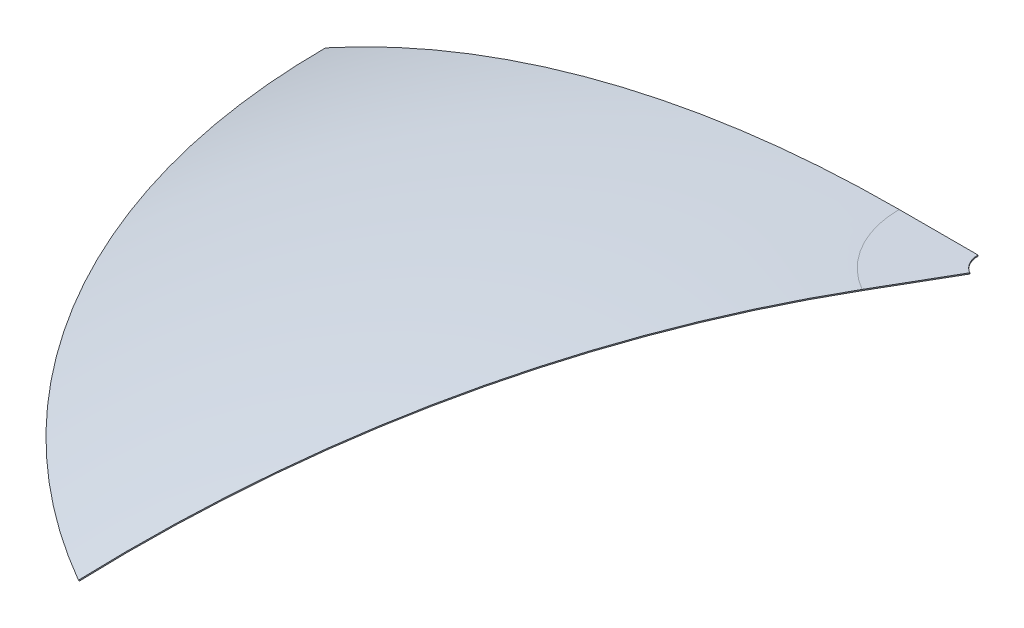
ISO-10303-21;
HEADER;
FILE_DESCRIPTION(('STEP AP214'),'2;1');
FILE_NAME('part.step','',(''),(''),'','','');
FILE_SCHEMA(('AUTOMOTIVE_DESIGN { 1 0 10303 214 1 1 1 1 }'));
ENDSEC;
DATA;
#1=APPLICATION_CONTEXT('core data for automotive mechanical design processes');
#2=APPLICATION_PROTOCOL_DEFINITION('international standard','automotive_design',2000,#1);
#3=PRODUCT_CONTEXT('',#1,'mechanical');
#4=PRODUCT('Part','Part','',(#3));
#5=PRODUCT_RELATED_PRODUCT_CATEGORY('part','',(#4));
#6=PRODUCT_DEFINITION_FORMATION('','',#4);
#7=PRODUCT_DEFINITION_CONTEXT('part definition',#1,'design');
#8=PRODUCT_DEFINITION('design','',#6,#7);
#9=PRODUCT_DEFINITION_SHAPE('','',#8);
#10=(LENGTH_UNIT() NAMED_UNIT(*) SI_UNIT(.MILLI.,.METRE.));
#11=(NAMED_UNIT(*) PLANE_ANGLE_UNIT() SI_UNIT($,.RADIAN.));
#12=(NAMED_UNIT(*) SI_UNIT($,.STERADIAN.) SOLID_ANGLE_UNIT());
#13=UNCERTAINTY_MEASURE_WITH_UNIT(LENGTH_MEASURE(1.E-05),#10,'distance_accuracy_value','');
#14=(GEOMETRIC_REPRESENTATION_CONTEXT(3) GLOBAL_UNCERTAINTY_ASSIGNED_CONTEXT((#13)) GLOBAL_UNIT_ASSIGNED_CONTEXT((#10,
#11,#12)) REPRESENTATION_CONTEXT('',''));
#15=CARTESIAN_POINT('',(0.,0.,0.));
#16=DIRECTION('',(0.,0.,1.));
#17=DIRECTION('',(1.,0.,0.));
#18=AXIS2_PLACEMENT_3D('',#15,#16,#17);
#19=CARTESIAN_POINT('',(-22.4999999999999,1.50000000000002,38.9711431702998));
#20=DIRECTION('',(0.,1.,0.));
#21=DIRECTION('',(-1.,0.,0.));
#22=AXIS2_PLACEMENT_3D('',#19,#20,#21);
#23=PLANE('',#22);
#24=CARTESIAN_POINT('',(0.,1.49999999999995,0.));
#25=DIRECTION('',(0.,-1.,0.));
#26=DIRECTION('',(1.,0.,0.));
#27=AXIS2_PLACEMENT_3D('',#24,#25,#26);
#28=CIRCLE('',#27,10.);
#29=CARTESIAN_POINT('',(-4.99999999999998,1.50000000000002,8.6602540378444));
#30=VERTEX_POINT('',#29);
#31=CARTESIAN_POINT('',(-10.,1.5,0.));
#32=VERTEX_POINT('',#31);
#33=EDGE_CURVE('E55',#30,#32,#28,.T.);
#34=ORIENTED_EDGE('',*,*,#33,.F.);
#35=DIRECTION('',(0.499999999999998,0.,-0.86602540378444));
#36=VECTOR('',#35,1.);
#37=CARTESIAN_POINT('',(-22.4999999999999,1.50000000000008,38.9711431702998));
#38=LINE('',#37,#36);
#39=CARTESIAN_POINT('',(-22.4999999999999,1.50000000000008,38.9711431702998));
#40=VERTEX_POINT('',#39);
#41=EDGE_CURVE('E128',#40,#30,#38,.T.);
#42=ORIENTED_EDGE('',*,*,#41,.F.);
#43=CARTESIAN_POINT('',(0.,1.50000000000017,0.));
#44=DIRECTION('',(0.,-1.,0.));
#45=DIRECTION('',(1.,0.,0.));
#46=AXIS2_PLACEMENT_3D('',#43,#44,#45);
#47=CIRCLE('',#46,45.);
#48=CARTESIAN_POINT('',(-45.,1.5,0.));
#49=VERTEX_POINT('',#48);
#50=EDGE_CURVE('E11',#40,#49,#47,.T.);
#51=ORIENTED_EDGE('',*,*,#50,.T.);
#52=DIRECTION('',(1.,0.,0.));
#53=VECTOR('',#52,1.);
#54=CARTESIAN_POINT('',(-45.,1.5,0.));
#55=LINE('',#54,#53);
#56=EDGE_CURVE('E125',#49,#32,#55,.T.);
#57=ORIENTED_EDGE('',*,*,#56,.T.);
#58=EDGE_LOOP('',(#34,#42,#51,#57));
#59=FACE_BOUND('',#58,.T.);
#60=ADVANCED_FACE('F47',(#59),#23,.F.);
#61=CARTESIAN_POINT('',(3.43024899888577E-12,-998.5,0.));
#62=DIRECTION('',(0.,-1.,0.));
#63=DIRECTION('',(1.,0.,0.));
#64=AXIS2_PLACEMENT_3D('',#61,#62,#63);
#65=CYLINDRICAL_SURFACE('',#64,10.);
#66=CARTESIAN_POINT('',(0.,2.00000000000011,0.));
#67=DIRECTION('',(0.,-1.,0.));
#68=DIRECTION('',(1.,0.,0.));
#69=AXIS2_PLACEMENT_3D('',#66,#67,#68);
#70=CIRCLE('',#69,10.);
#71=CARTESIAN_POINT('',(-4.99999999999998,2.00000000000002,8.6602540378444));
#72=VERTEX_POINT('',#71);
#73=CARTESIAN_POINT('',(-10.,2.,0.));
#74=VERTEX_POINT('',#73);
#75=EDGE_CURVE('E172',#72,#74,#70,.T.);
#76=ORIENTED_EDGE('',*,*,#75,.F.);
#77=DIRECTION('',(0.,1.,0.));
#78=VECTOR('',#77,1.);
#79=CARTESIAN_POINT('',(-4.99999999999998,2.00000000000002,8.6602540378444));
#80=LINE('',#79,#78);
#81=EDGE_CURVE('E152',#30,#72,#80,.T.);
#82=ORIENTED_EDGE('',*,*,#81,.F.);
#83=ORIENTED_EDGE('',*,*,#33,.T.);
#84=DIRECTION('',(0.,1.,0.));
#85=VECTOR('',#84,1.);
#86=CARTESIAN_POINT('',(-10.,2.,0.));
#87=LINE('',#86,#85);
#88=EDGE_CURVE('E132',#32,#74,#87,.T.);
#89=ORIENTED_EDGE('',*,*,#88,.T.);
#90=EDGE_LOOP('',(#76,#82,#83,#89));
#91=FACE_BOUND('',#90,.T.);
#92=ADVANCED_FACE('F177',(#91),#65,.F.);
#93=CARTESIAN_POINT('',(-22.4999999999999,2.00000000000002,38.9711431702998));
#94=DIRECTION('',(0.,-1.,0.));
#95=DIRECTION('',(1.,0.,0.));
#96=AXIS2_PLACEMENT_3D('',#93,#94,#95);
#97=PLANE('',#96);
#98=CARTESIAN_POINT('',(0.,2.00000000000011,0.));
#99=DIRECTION('',(0.,-1.,0.));
#100=DIRECTION('',(1.,0.,0.));
#101=AXIS2_PLACEMENT_3D('',#98,#99,#100);
#102=CIRCLE('',#101,45.);
#103=CARTESIAN_POINT('',(-22.4999999999999,2.00000000000008,38.9711431702998));
#104=VERTEX_POINT('',#103);
#105=CARTESIAN_POINT('',(-45.,2.,0.));
#106=VERTEX_POINT('',#105);
#107=EDGE_CURVE('E169',#104,#106,#102,.T.);
#108=ORIENTED_EDGE('',*,*,#107,.F.);
#109=DIRECTION('',(-0.499999999999998,0.,0.86602540378444));
#110=VECTOR('',#109,1.);
#111=CARTESIAN_POINT('',(-22.4999999999999,2.00000000000008,38.9711431702998));
#112=LINE('',#111,#110);
#113=EDGE_CURVE('E156',#72,#104,#112,.T.);
#114=ORIENTED_EDGE('',*,*,#113,.F.);
#115=ORIENTED_EDGE('',*,*,#75,.T.);
#116=DIRECTION('',(-1.,0.,0.));
#117=VECTOR('',#116,1.);
#118=CARTESIAN_POINT('',(-45.,2.,0.));
#119=LINE('',#118,#117);
#120=EDGE_CURVE('E138',#74,#106,#119,.T.);
#121=ORIENTED_EDGE('',*,*,#120,.T.);
#122=EDGE_LOOP('',(#108,#114,#115,#121));
#123=FACE_BOUND('',#122,.T.);
#124=ADVANCED_FACE('F187',(#123),#97,.F.);
#125=CARTESIAN_POINT('',(1.81799020282369E-12,-528.163893918988,0.));
#126=DIRECTION('',(0.,-1.,0.));
#127=DIRECTION('',(1.,0.,0.));
#128=AXIS2_PLACEMENT_3D('',#125,#126,#127);
#129=DEGENERATE_TOROIDAL_SURFACE('',#128,45.0000000000018,530.163893918988,.T.);
#130=CARTESIAN_POINT('',(2.21974962611907E-13,-63.2110348793953,0.));
#131=DIRECTION('',(0.,-1.,0.));
#132=DIRECTION('',(1.,0.,0.));
#133=AXIS2_PLACEMENT_3D('',#130,#131,#132);
#134=CIRCLE('',#133,299.740246695048);
#135=CARTESIAN_POINT('',(-149.870123347523,-63.2110348793959,259.582668174526));
#136=VERTEX_POINT('',#135);
#137=CARTESIAN_POINT('',(-299.740246695048,-63.2110348793964,0.));
#138=VERTEX_POINT('',#137);
#139=EDGE_CURVE('E165',#136,#138,#134,.T.);
#140=ORIENTED_EDGE('',*,*,#139,.F.);
#141=CARTESIAN_POINT('',(-22.499999999999,-528.163893918988,38.9711431703014));
#142=DIRECTION('',(0.86602540378444,0.,0.499999999999998));
#143=DIRECTION('',(0.499999999999998,0.,-0.86602540378444));
#144=AXIS2_PLACEMENT_3D('',#141,#142,#143);
#145=CIRCLE('',#144,530.163893918988);
#146=EDGE_CURVE('E73',#104,#136,#145,.T.);
#147=ORIENTED_EDGE('',*,*,#146,.F.);
#148=ORIENTED_EDGE('',*,*,#107,.T.);
#149=CARTESIAN_POINT('',(-45.,-528.163893918988,0.));
#150=DIRECTION('',(0.,0.,1.));
#151=DIRECTION('',(1.,0.,0.));
#152=AXIS2_PLACEMENT_3D('',#149,#150,#151);
#153=CIRCLE('',#152,530.163893918988);
#154=EDGE_CURVE('E144',#106,#138,#153,.T.);
#155=ORIENTED_EDGE('',*,*,#154,.T.);
#156=EDGE_LOOP('',(#140,#147,#148,#155));
#157=FACE_BOUND('',#156,.T.);
#158=ADVANCED_FACE('F185',(#157),#129,.T.);
#159=CARTESIAN_POINT('',(2.21974962611907E-13,-63.2110348793953,0.));
#160=DIRECTION('',(0.,1.,0.));
#161=DIRECTION('',(-1.,0.,0.));
#162=AXIS2_PLACEMENT_3D('',#159,#160,#161);
#163=CONICAL_SURFACE('',#162,299.740246695048,0.501217215293902);
#164=CARTESIAN_POINT('',(2.23479123964221E-13,-63.6495340533042,0.));
#165=DIRECTION('',(0.,-1.,0.));
#166=DIRECTION('',(1.,0.,0.));
#167=AXIS2_PLACEMENT_3D('',#164,#165,#166);
#168=CIRCLE('',#167,299.5);
#169=CARTESIAN_POINT('',(-149.749999999999,-63.6495340533047,259.37460843344));
#170=VERTEX_POINT('',#169);
#171=CARTESIAN_POINT('',(-299.5,-63.6495340533053,0.));
#172=VERTEX_POINT('',#171);
#173=EDGE_CURVE('E114',#170,#172,#168,.T.);
#174=ORIENTED_EDGE('',*,*,#173,.F.);
#175=DIRECTION('',(0.240246695047427,-0.876998347817804,-0.416119482172646));
#176=VECTOR('',#175,1.);
#177=CARTESIAN_POINT('',(-149.870123347523,-63.2110348793959,259.582668174526));
#178=LINE('',#177,#176);
#179=EDGE_CURVE('E160',#136,#170,#178,.T.);
#180=ORIENTED_EDGE('',*,*,#179,.F.);
#181=ORIENTED_EDGE('',*,*,#139,.T.);
#182=DIRECTION('',(0.480493390094852,-0.876998347817803,0.));
#183=VECTOR('',#182,1.);
#184=CARTESIAN_POINT('',(-299.740246695048,-63.2110348793964,0.));
#185=LINE('',#184,#183);
#186=EDGE_CURVE('E120',#138,#172,#185,.T.);
#187=ORIENTED_EDGE('',*,*,#186,.T.);
#188=EDGE_LOOP('',(#174,#180,#181,#187));
#189=FACE_BOUND('',#188,.T.);
#190=ADVANCED_FACE('F182',(#189),#163,.T.);
#191=CARTESIAN_POINT('',(1.81799020282369E-12,-528.163893918988,0.));
#192=DIRECTION('',(0.,-1.,0.));
#193=DIRECTION('',(1.,0.,0.));
#194=AXIS2_PLACEMENT_3D('',#191,#192,#193);
#195=DEGENERATE_TOROIDAL_SURFACE('',#194,45.0000000000018,529.663893918988,.T.);
#196=CARTESIAN_POINT('',(-22.499999999999,-528.163893918988,38.9711431703014));
#197=DIRECTION('',(-0.86602540378444,0.,-0.499999999999998));
#198=DIRECTION('',(0.499999999999998,0.,-0.86602540378444));
#199=AXIS2_PLACEMENT_3D('',#196,#197,#198);
#200=CIRCLE('',#199,529.663893918988);
#201=EDGE_CURVE('E65',#170,#40,#200,.T.);
#202=ORIENTED_EDGE('',*,*,#201,.F.);
#203=ORIENTED_EDGE('',*,*,#173,.T.);
#204=CARTESIAN_POINT('',(-45.,-528.163893918988,0.));
#205=DIRECTION('',(0.,0.,-1.));
#206=DIRECTION('',(1.,0.,0.));
#207=AXIS2_PLACEMENT_3D('',#204,#205,#206);
#208=CIRCLE('',#207,529.663893918988);
#209=EDGE_CURVE('E112',#172,#49,#208,.T.);
#210=ORIENTED_EDGE('',*,*,#209,.T.);
#211=ORIENTED_EDGE('',*,*,#50,.F.);
#212=EDGE_LOOP('',(#202,#203,#210,#211));
#213=FACE_BOUND('',#212,.T.);
#214=ADVANCED_FACE('F113',(#213),#195,.F.);
#215=CARTESIAN_POINT('',(-22.499999999999,-528.163893918988,38.9711431703014));
#216=DIRECTION('',(0.86602540378444,0.,0.499999999999998));
#217=DIRECTION('',(0.499999999999998,0.,-0.86602540378444));
#218=AXIS2_PLACEMENT_3D('',#215,#216,#217);
#219=PLANE('',#218);
#220=ORIENTED_EDGE('',*,*,#201,.T.);
#221=ORIENTED_EDGE('',*,*,#41,.T.);
#222=ORIENTED_EDGE('',*,*,#81,.T.);
#223=ORIENTED_EDGE('',*,*,#113,.T.);
#224=ORIENTED_EDGE('',*,*,#146,.T.);
#225=ORIENTED_EDGE('',*,*,#179,.T.);
#226=EDGE_LOOP('',(#220,#221,#222,#223,#224,#225));
#227=FACE_BOUND('',#226,.T.);
#228=ADVANCED_FACE('F178',(#227),#219,.T.);
#229=CARTESIAN_POINT('',(-45.,-528.163893918988,0.));
#230=DIRECTION('',(0.,0.,1.));
#231=DIRECTION('',(1.,0.,0.));
#232=AXIS2_PLACEMENT_3D('',#229,#230,#231);
#233=PLANE('',#232);
#234=ORIENTED_EDGE('',*,*,#56,.F.);
#235=ORIENTED_EDGE('',*,*,#209,.F.);
#236=ORIENTED_EDGE('',*,*,#186,.F.);
#237=ORIENTED_EDGE('',*,*,#154,.F.);
#238=ORIENTED_EDGE('',*,*,#120,.F.);
#239=ORIENTED_EDGE('',*,*,#88,.F.);
#240=EDGE_LOOP('',(#234,#235,#236,#237,#238,#239));
#241=FACE_BOUND('',#240,.T.);
#242=ADVANCED_FACE('F129',(#241),#233,.F.);
#243=CLOSED_SHELL('',(#60,#92,#124,#158,#190,#214,#228,#242));
#244=MANIFOLD_SOLID_BREP('B2',#243);
#245=ADVANCED_BREP_SHAPE_REPRESENTATION('',(#18,#244),#14);
#246=SHAPE_DEFINITION_REPRESENTATION(#9,#245);
ENDSEC;
END-ISO-10303-21;
